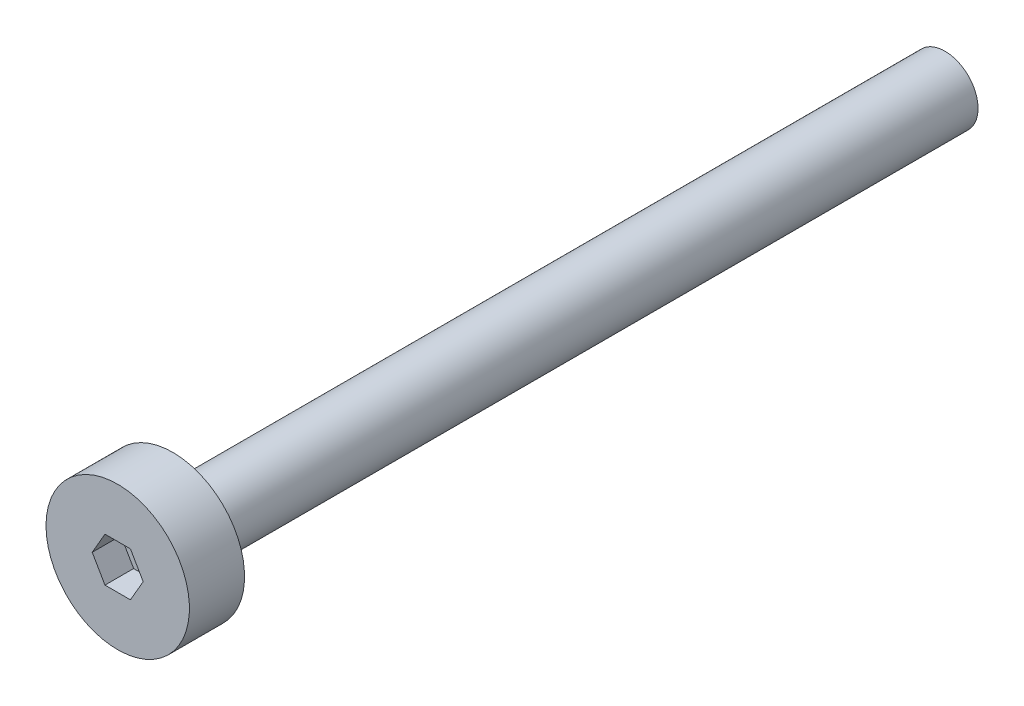
ISO-10303-21;
HEADER;
FILE_DESCRIPTION(('STEP AP214'),'2;1');
FILE_NAME('part.step','',(''),(''),'','','');
FILE_SCHEMA(('AUTOMOTIVE_DESIGN { 1 0 10303 214 1 1 1 1 }'));
ENDSEC;
DATA;
#1=APPLICATION_CONTEXT('core data for automotive mechanical design processes');
#2=APPLICATION_PROTOCOL_DEFINITION('international standard','automotive_design',2000,#1);
#3=PRODUCT_CONTEXT('',#1,'mechanical');
#4=PRODUCT('Part','Part','',(#3));
#5=PRODUCT_RELATED_PRODUCT_CATEGORY('part','',(#4));
#6=PRODUCT_DEFINITION_FORMATION('','',#4);
#7=PRODUCT_DEFINITION_CONTEXT('part definition',#1,'design');
#8=PRODUCT_DEFINITION('design','',#6,#7);
#9=PRODUCT_DEFINITION_SHAPE('','',#8);
#10=(LENGTH_UNIT() NAMED_UNIT(*) SI_UNIT(.MILLI.,.METRE.));
#11=(NAMED_UNIT(*) PLANE_ANGLE_UNIT() SI_UNIT($,.RADIAN.));
#12=(NAMED_UNIT(*) SI_UNIT($,.STERADIAN.) SOLID_ANGLE_UNIT());
#13=UNCERTAINTY_MEASURE_WITH_UNIT(LENGTH_MEASURE(1.E-05),#10,'distance_accuracy_value','');
#14=(GEOMETRIC_REPRESENTATION_CONTEXT(3) GLOBAL_UNCERTAINTY_ASSIGNED_CONTEXT((#13)) GLOBAL_UNIT_ASSIGNED_CONTEXT((#10,
#11,#12)) REPRESENTATION_CONTEXT('',''));
#15=CARTESIAN_POINT('',(0.,0.,0.));
#16=DIRECTION('',(0.,0.,1.));
#17=DIRECTION('',(1.,0.,0.));
#18=AXIS2_PLACEMENT_3D('',#15,#16,#17);
#19=CARTESIAN_POINT('',(0.,0.,1.2));
#20=DIRECTION('',(0.,0.,1.));
#21=DIRECTION('',(1.,0.,0.));
#22=AXIS2_PLACEMENT_3D('',#19,#20,#21);
#23=PLANE('',#22);
#24=DIRECTION('',(-0.50000000000019,0.866025403784329,0.));
#25=VECTOR('',#24,1.);
#26=CARTESIAN_POINT('',(1.154700538379,0.,1.2));
#27=LINE('',#26,#25);
#28=CARTESIAN_POINT('',(1.154700538379,0.,1.2));
#29=VERTEX_POINT('',#28);
#30=CARTESIAN_POINT('',(0.57735026919,1.,1.2));
#31=VERTEX_POINT('',#30);
#32=EDGE_CURVE('E10',#29,#31,#27,.T.);
#33=ORIENTED_EDGE('',*,*,#32,.T.);
#34=DIRECTION('',(-1.,0.,0.));
#35=VECTOR('',#34,1.);
#36=CARTESIAN_POINT('',(0.57735026919,1.,1.2));
#37=LINE('',#36,#35);
#38=CARTESIAN_POINT('',(-0.57735026919,1.,1.2));
#39=VERTEX_POINT('',#38);
#40=EDGE_CURVE('E19',#31,#39,#37,.T.);
#41=ORIENTED_EDGE('',*,*,#40,.T.);
#42=DIRECTION('',(-0.50000000000019,-0.866025403784329,0.));
#43=VECTOR('',#42,1.);
#44=CARTESIAN_POINT('',(-0.57735026919,1.,1.2));
#45=LINE('',#44,#43);
#46=CARTESIAN_POINT('',(-1.154700538379,0.,1.2));
#47=VERTEX_POINT('',#46);
#48=EDGE_CURVE('E151',#39,#47,#45,.T.);
#49=ORIENTED_EDGE('',*,*,#48,.T.);
#50=DIRECTION('',(0.50000000000019,-0.866025403784329,0.));
#51=VECTOR('',#50,1.);
#52=CARTESIAN_POINT('',(-1.154700538379,0.,1.2));
#53=LINE('',#52,#51);
#54=CARTESIAN_POINT('',(-0.57735026919,-1.,1.2));
#55=VERTEX_POINT('',#54);
#56=EDGE_CURVE('E163',#47,#55,#53,.T.);
#57=ORIENTED_EDGE('',*,*,#56,.T.);
#58=DIRECTION('',(1.,0.,0.));
#59=VECTOR('',#58,1.);
#60=CARTESIAN_POINT('',(-0.57735026919,-1.,1.2));
#61=LINE('',#60,#59);
#62=CARTESIAN_POINT('',(0.57735026919,-1.,1.2));
#63=VERTEX_POINT('',#62);
#64=EDGE_CURVE('E121',#55,#63,#61,.T.);
#65=ORIENTED_EDGE('',*,*,#64,.T.);
#66=DIRECTION('',(0.50000000000019,0.866025403784329,0.));
#67=VECTOR('',#66,1.);
#68=CARTESIAN_POINT('',(0.57735026919,-1.,1.2));
#69=LINE('',#68,#67);
#70=EDGE_CURVE('E116',#63,#29,#69,.T.);
#71=ORIENTED_EDGE('',*,*,#70,.T.);
#72=EDGE_LOOP('',(#33,#41,#49,#57,#65,#71));
#73=FACE_BOUND('',#72,.T.);
#74=ADVANCED_FACE('F15',(#73),#23,.T.);
#75=CARTESIAN_POINT('',(0.,0.,-35.));
#76=DIRECTION('',(0.,0.,-1.));
#77=DIRECTION('',(0.,-1.,0.));
#78=AXIS2_PLACEMENT_3D('',#75,#76,#77);
#79=PLANE('',#78);
#80=CARTESIAN_POINT('',(0.,0.,-35.));
#81=DIRECTION('',(0.,0.,-1.));
#82=DIRECTION('',(-1.,0.,0.));
#83=AXIS2_PLACEMENT_3D('',#80,#81,#82);
#84=CIRCLE('',#83,1.5);
#85=CARTESIAN_POINT('',(-1.5,0.,-35.));
#86=VERTEX_POINT('',#85);
#87=EDGE_CURVE('E135',#86,#86,#84,.T.);
#88=ORIENTED_EDGE('',*,*,#87,.T.);
#89=EDGE_LOOP('',(#88));
#90=FACE_BOUND('',#89,.T.);
#91=ADVANCED_FACE('F236',(#90),#79,.T.);
#92=CARTESIAN_POINT('',(1.154700538379,0.,1.2));
#93=DIRECTION('',(-0.866025403784329,-0.50000000000019,0.));
#94=DIRECTION('',(-0.50000000000019,0.866025403784329,0.));
#95=AXIS2_PLACEMENT_3D('',#92,#93,#94);
#96=PLANE('',#95);
#97=ORIENTED_EDGE('',*,*,#32,.F.);
#98=DIRECTION('',(0.,0.,1.));
#99=VECTOR('',#98,1.);
#100=CARTESIAN_POINT('',(1.154700538379,0.,1.2));
#101=LINE('',#100,#99);
#102=CARTESIAN_POINT('',(1.154700538379,0.,2.5));
#103=VERTEX_POINT('',#102);
#104=EDGE_CURVE('E111',#29,#103,#101,.T.);
#105=ORIENTED_EDGE('',*,*,#104,.T.);
#106=DIRECTION('',(-0.50000000000019,0.866025403784329,0.));
#107=VECTOR('',#106,1.);
#108=CARTESIAN_POINT('',(1.010362971082,0.25,2.5));
#109=LINE('',#108,#107);
#110=CARTESIAN_POINT('',(0.57735026919,1.,2.5));
#111=VERTEX_POINT('',#110);
#112=EDGE_CURVE('E168',#103,#111,#109,.T.);
#113=ORIENTED_EDGE('',*,*,#112,.T.);
#114=DIRECTION('',(0.,0.,1.));
#115=VECTOR('',#114,1.);
#116=CARTESIAN_POINT('',(0.57735026919,1.,1.2));
#117=LINE('',#116,#115);
#118=EDGE_CURVE('E25',#31,#111,#117,.T.);
#119=ORIENTED_EDGE('',*,*,#118,.F.);
#120=EDGE_LOOP('',(#97,#105,#113,#119));
#121=FACE_BOUND('',#120,.T.);
#122=ADVANCED_FACE('F109',(#121),#96,.T.);
#123=CARTESIAN_POINT('',(0.57735026919,1.,1.2));
#124=DIRECTION('',(0.,-1.,0.));
#125=DIRECTION('',(-1.,0.,0.));
#126=AXIS2_PLACEMENT_3D('',#123,#124,#125);
#127=PLANE('',#126);
#128=ORIENTED_EDGE('',*,*,#40,.F.);
#129=ORIENTED_EDGE('',*,*,#118,.T.);
#130=DIRECTION('',(-1.,0.,0.));
#131=VECTOR('',#130,1.);
#132=CARTESIAN_POINT('',(0.288675134595,1.,2.5));
#133=LINE('',#132,#131);
#134=CARTESIAN_POINT('',(-0.57735026919,1.,2.5));
#135=VERTEX_POINT('',#134);
#136=EDGE_CURVE('E145',#111,#135,#133,.T.);
#137=ORIENTED_EDGE('',*,*,#136,.T.);
#138=DIRECTION('',(0.,0.,1.));
#139=VECTOR('',#138,1.);
#140=CARTESIAN_POINT('',(-0.57735026919,1.,1.2));
#141=LINE('',#140,#139);
#142=EDGE_CURVE('E153',#39,#135,#141,.T.);
#143=ORIENTED_EDGE('',*,*,#142,.F.);
#144=EDGE_LOOP('',(#128,#129,#137,#143));
#145=FACE_BOUND('',#144,.T.);
#146=ADVANCED_FACE('F211',(#145),#127,.T.);
#147=CARTESIAN_POINT('',(-0.57735026919,1.,1.2));
#148=DIRECTION('',(0.866025403784329,-0.50000000000019,0.));
#149=DIRECTION('',(0.,0.,-1.));
#150=AXIS2_PLACEMENT_3D('',#147,#148,#149);
#151=PLANE('',#150);
#152=ORIENTED_EDGE('',*,*,#48,.F.);
#153=ORIENTED_EDGE('',*,*,#142,.T.);
#154=DIRECTION('',(-0.50000000000019,-0.866025403784329,0.));
#155=VECTOR('',#154,1.);
#156=CARTESIAN_POINT('',(-0.721687836487,0.75,2.5));
#157=LINE('',#156,#155);
#158=CARTESIAN_POINT('',(-1.154700538379,0.,2.5));
#159=VERTEX_POINT('',#158);
#160=EDGE_CURVE('E142',#135,#159,#157,.T.);
#161=ORIENTED_EDGE('',*,*,#160,.T.);
#162=DIRECTION('',(0.,0.,1.));
#163=VECTOR('',#162,1.);
#164=CARTESIAN_POINT('',(-1.154700538379,0.,1.2));
#165=LINE('',#164,#163);
#166=EDGE_CURVE('E154',#47,#159,#165,.T.);
#167=ORIENTED_EDGE('',*,*,#166,.F.);
#168=EDGE_LOOP('',(#152,#153,#161,#167));
#169=FACE_BOUND('',#168,.T.);
#170=ADVANCED_FACE('F17',(#169),#151,.T.);
#171=CARTESIAN_POINT('',(-1.154700538379,0.,1.2));
#172=DIRECTION('',(0.866025403784329,0.50000000000019,0.));
#173=DIRECTION('',(0.,0.,-1.));
#174=AXIS2_PLACEMENT_3D('',#171,#172,#173);
#175=PLANE('',#174);
#176=ORIENTED_EDGE('',*,*,#56,.F.);
#177=ORIENTED_EDGE('',*,*,#166,.T.);
#178=DIRECTION('',(0.50000000000019,-0.866025403784329,0.));
#179=VECTOR('',#178,1.);
#180=CARTESIAN_POINT('',(-1.010362971082,-0.25,2.5));
#181=LINE('',#180,#179);
#182=CARTESIAN_POINT('',(-0.57735026919,-1.,2.5));
#183=VERTEX_POINT('',#182);
#184=EDGE_CURVE('E146',#159,#183,#181,.T.);
#185=ORIENTED_EDGE('',*,*,#184,.T.);
#186=DIRECTION('',(0.,0.,1.));
#187=VECTOR('',#186,1.);
#188=CARTESIAN_POINT('',(-0.57735026919,-1.,1.2));
#189=LINE('',#188,#187);
#190=EDGE_CURVE('E150',#55,#183,#189,.T.);
#191=ORIENTED_EDGE('',*,*,#190,.F.);
#192=EDGE_LOOP('',(#176,#177,#185,#191));
#193=FACE_BOUND('',#192,.T.);
#194=ADVANCED_FACE('F248',(#193),#175,.T.);
#195=CARTESIAN_POINT('',(-0.57735026919,-1.,1.2));
#196=DIRECTION('',(0.,1.,0.));
#197=DIRECTION('',(1.,0.,0.));
#198=AXIS2_PLACEMENT_3D('',#195,#196,#197);
#199=PLANE('',#198);
#200=ORIENTED_EDGE('',*,*,#64,.F.);
#201=ORIENTED_EDGE('',*,*,#190,.T.);
#202=DIRECTION('',(1.,0.,0.));
#203=VECTOR('',#202,1.);
#204=CARTESIAN_POINT('',(-0.288675134595,-1.,2.5));
#205=LINE('',#204,#203);
#206=CARTESIAN_POINT('',(0.57735026919,-1.,2.5));
#207=VERTEX_POINT('',#206);
#208=EDGE_CURVE('E159',#183,#207,#205,.T.);
#209=ORIENTED_EDGE('',*,*,#208,.T.);
#210=DIRECTION('',(0.,0.,1.));
#211=VECTOR('',#210,1.);
#212=CARTESIAN_POINT('',(0.57735026919,-1.,1.2));
#213=LINE('',#212,#211);
#214=EDGE_CURVE('E122',#63,#207,#213,.T.);
#215=ORIENTED_EDGE('',*,*,#214,.F.);
#216=EDGE_LOOP('',(#200,#201,#209,#215));
#217=FACE_BOUND('',#216,.T.);
#218=ADVANCED_FACE('F203',(#217),#199,.T.);
#219=CARTESIAN_POINT('',(0.57735026919,-1.,1.2));
#220=DIRECTION('',(-0.866025403784329,0.50000000000019,0.));
#221=DIRECTION('',(0.,0.,1.));
#222=AXIS2_PLACEMENT_3D('',#219,#220,#221);
#223=PLANE('',#222);
#224=ORIENTED_EDGE('',*,*,#70,.F.);
#225=ORIENTED_EDGE('',*,*,#214,.T.);
#226=DIRECTION('',(0.50000000000019,0.866025403784329,0.));
#227=VECTOR('',#226,1.);
#228=CARTESIAN_POINT('',(0.721687836487,-0.75,2.5));
#229=LINE('',#228,#227);
#230=EDGE_CURVE('E118',#207,#103,#229,.T.);
#231=ORIENTED_EDGE('',*,*,#230,.T.);
#232=ORIENTED_EDGE('',*,*,#104,.F.);
#233=EDGE_LOOP('',(#224,#225,#231,#232));
#234=FACE_BOUND('',#233,.T.);
#235=ADVANCED_FACE('F115',(#234),#223,.T.);
#236=CARTESIAN_POINT('',(0.,0.,0.));
#237=DIRECTION('',(0.,0.,-1.));
#238=DIRECTION('',(-1.,0.,0.));
#239=AXIS2_PLACEMENT_3D('',#236,#237,#238);
#240=CYLINDRICAL_SURFACE('',#239,1.5);
#241=ORIENTED_EDGE('',*,*,#87,.F.);
#242=DIRECTION('',(0.,0.,-1.));
#243=VECTOR('',#242,1.);
#244=CARTESIAN_POINT('',(-1.5,0.,0.));
#245=LINE('',#244,#243);
#246=CARTESIAN_POINT('',(-1.5,0.,0.));
#247=VERTEX_POINT('',#246);
#248=EDGE_CURVE('E127',#247,#86,#245,.T.);
#249=ORIENTED_EDGE('',*,*,#248,.F.);
#250=CARTESIAN_POINT('',(0.,0.,0.));
#251=DIRECTION('',(0.,0.,-1.));
#252=DIRECTION('',(-1.,0.,0.));
#253=AXIS2_PLACEMENT_3D('',#250,#251,#252);
#254=CIRCLE('',#253,1.5);
#255=EDGE_CURVE('E156',#247,#247,#254,.T.);
#256=ORIENTED_EDGE('',*,*,#255,.T.);
#257=ORIENTED_EDGE('',*,*,#248,.T.);
#258=EDGE_LOOP('',(#241,#249,#256,#257));
#259=FACE_BOUND('',#258,.T.);
#260=ADVANCED_FACE('F216',(#259),#240,.T.);
#261=CARTESIAN_POINT('',(0.,0.,2.5));
#262=DIRECTION('',(0.,0.,-1.));
#263=DIRECTION('',(0.,-1.,0.));
#264=AXIS2_PLACEMENT_3D('',#261,#262,#263);
#265=PLANE('',#264);
#266=ORIENTED_EDGE('',*,*,#208,.F.);
#267=ORIENTED_EDGE('',*,*,#184,.F.);
#268=ORIENTED_EDGE('',*,*,#160,.F.);
#269=ORIENTED_EDGE('',*,*,#136,.F.);
#270=ORIENTED_EDGE('',*,*,#112,.F.);
#271=ORIENTED_EDGE('',*,*,#230,.F.);
#272=EDGE_LOOP('',(#266,#267,#268,#269,#270,#271));
#273=FACE_BOUND('',#272,.T.);
#274=CARTESIAN_POINT('',(0.,0.,2.5));
#275=DIRECTION('',(0.,0.,-1.));
#276=DIRECTION('',(-1.,0.,0.));
#277=AXIS2_PLACEMENT_3D('',#274,#275,#276);
#278=CIRCLE('',#277,3.25);
#279=CARTESIAN_POINT('',(-3.25,0.,2.5));
#280=VERTEX_POINT('',#279);
#281=EDGE_CURVE('E84',#280,#280,#278,.T.);
#282=ORIENTED_EDGE('',*,*,#281,.F.);
#283=EDGE_LOOP('',(#282));
#284=FACE_BOUND('',#283,.T.);
#285=ADVANCED_FACE('F206',(#273,#284),#265,.F.);
#286=CARTESIAN_POINT('',(0.,0.,0.));
#287=DIRECTION('',(0.,0.,-1.));
#288=DIRECTION('',(0.,-1.,0.));
#289=AXIS2_PLACEMENT_3D('',#286,#287,#288);
#290=PLANE('',#289);
#291=ORIENTED_EDGE('',*,*,#255,.F.);
#292=EDGE_LOOP('',(#291));
#293=FACE_BOUND('',#292,.T.);
#294=CARTESIAN_POINT('',(0.,0.,0.));
#295=DIRECTION('',(0.,0.,-1.));
#296=DIRECTION('',(-1.,0.,0.));
#297=AXIS2_PLACEMENT_3D('',#294,#295,#296);
#298=CIRCLE('',#297,3.25);
#299=CARTESIAN_POINT('',(-3.25,0.,0.));
#300=VERTEX_POINT('',#299);
#301=EDGE_CURVE('E141',#300,#300,#298,.T.);
#302=ORIENTED_EDGE('',*,*,#301,.T.);
#303=EDGE_LOOP('',(#302));
#304=FACE_BOUND('',#303,.T.);
#305=ADVANCED_FACE('F277',(#293,#304),#290,.T.);
#306=CARTESIAN_POINT('',(0.,0.,2.5));
#307=DIRECTION('',(0.,0.,-1.));
#308=DIRECTION('',(-1.,0.,0.));
#309=AXIS2_PLACEMENT_3D('',#306,#307,#308);
#310=CYLINDRICAL_SURFACE('',#309,3.25);
#311=ORIENTED_EDGE('',*,*,#301,.F.);
#312=DIRECTION('',(0.,0.,-1.));
#313=VECTOR('',#312,1.);
#314=CARTESIAN_POINT('',(-3.25,0.,2.5));
#315=LINE('',#314,#313);
#316=EDGE_CURVE('E76',#280,#300,#315,.T.);
#317=ORIENTED_EDGE('',*,*,#316,.F.);
#318=ORIENTED_EDGE('',*,*,#281,.T.);
#319=ORIENTED_EDGE('',*,*,#316,.T.);
#320=EDGE_LOOP('',(#311,#317,#318,#319));
#321=FACE_BOUND('',#320,.T.);
#322=ADVANCED_FACE('F272',(#321),#310,.T.);
#323=CLOSED_SHELL('',(#74,#91,#122,#146,#170,#194,#218,#235,#260,#285,#305,#322));
#324=MANIFOLD_SOLID_BREP('B1',#323);
#325=ADVANCED_BREP_SHAPE_REPRESENTATION('',(#18,#324),#14);
#326=SHAPE_DEFINITION_REPRESENTATION(#9,#325);
ENDSEC;
END-ISO-10303-21;
